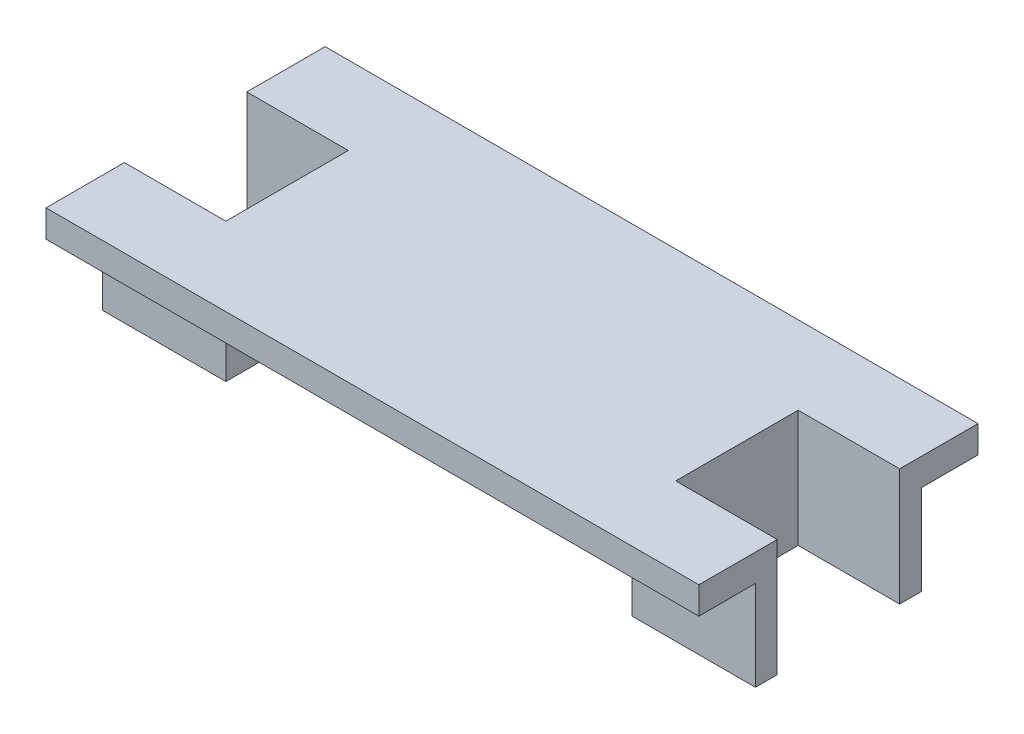
ISO-10303-21;
HEADER;
FILE_DESCRIPTION(('STEP AP214'),'2;1');
FILE_NAME('part.step','',(''),(''),'','','');
FILE_SCHEMA(('AUTOMOTIVE_DESIGN { 1 0 10303 214 1 1 1 1 }'));
ENDSEC;
DATA;
#1=APPLICATION_CONTEXT('core data for automotive mechanical design processes');
#2=APPLICATION_PROTOCOL_DEFINITION('international standard','automotive_design',2000,#1);
#3=PRODUCT_CONTEXT('',#1,'mechanical');
#4=PRODUCT('Part','Part','',(#3));
#5=PRODUCT_RELATED_PRODUCT_CATEGORY('part','',(#4));
#6=PRODUCT_DEFINITION_FORMATION('','',#4);
#7=PRODUCT_DEFINITION_CONTEXT('part definition',#1,'design');
#8=PRODUCT_DEFINITION('design','',#6,#7);
#9=PRODUCT_DEFINITION_SHAPE('','',#8);
#10=(LENGTH_UNIT() NAMED_UNIT(*) SI_UNIT(.MILLI.,.METRE.));
#11=(NAMED_UNIT(*) PLANE_ANGLE_UNIT() SI_UNIT($,.RADIAN.));
#12=(NAMED_UNIT(*) SI_UNIT($,.STERADIAN.) SOLID_ANGLE_UNIT());
#13=UNCERTAINTY_MEASURE_WITH_UNIT(LENGTH_MEASURE(1.E-05),#10,'distance_accuracy_value','');
#14=(GEOMETRIC_REPRESENTATION_CONTEXT(3) GLOBAL_UNCERTAINTY_ASSIGNED_CONTEXT((#13)) GLOBAL_UNIT_ASSIGNED_CONTEXT((#10,
#11,#12)) REPRESENTATION_CONTEXT('',''));
#15=CARTESIAN_POINT('',(0.,0.,0.));
#16=DIRECTION('',(0.,0.,1.));
#17=DIRECTION('',(1.,0.,0.));
#18=AXIS2_PLACEMENT_3D('',#15,#16,#17);
#19=CARTESIAN_POINT('',(0.,0.,0.));
#20=DIRECTION('',(0.,1.,0.));
#21=DIRECTION('',(0.,0.,1.));
#22=AXIS2_PLACEMENT_3D('',#19,#20,#21);
#23=PLANE('',#22);
#24=DIRECTION('',(1.,0.,0.));
#25=VECTOR('',#24,1.);
#26=CARTESIAN_POINT('',(-37.343,0.,-15.2535));
#27=LINE('',#26,#25);
#28=CARTESIAN_POINT('',(-60.,0.,-15.2535));
#29=VERTEX_POINT('',#28);
#30=CARTESIAN_POINT('',(-37.343,0.,-15.2535));
#31=VERTEX_POINT('',#30);
#32=EDGE_CURVE('E227',#29,#31,#27,.T.);
#33=ORIENTED_EDGE('',*,*,#32,.F.);
#34=DIRECTION('',(0.,0.,1.));
#35=VECTOR('',#34,1.);
#36=CARTESIAN_POINT('',(-60.,0.,-25.6535));
#37=LINE('',#36,#35);
#38=CARTESIAN_POINT('',(-60.,0.,-25.6535));
#39=VERTEX_POINT('',#38);
#40=EDGE_CURVE('E347',#39,#29,#37,.T.);
#41=ORIENTED_EDGE('',*,*,#40,.F.);
#42=DIRECTION('',(-1.,0.,0.));
#43=VECTOR('',#42,1.);
#44=CARTESIAN_POINT('',(-60.,0.,-25.6535));
#45=LINE('',#44,#43);
#46=CARTESIAN_POINT('',(60.,0.,-25.6535));
#47=VERTEX_POINT('',#46);
#48=EDGE_CURVE('E344',#47,#39,#45,.T.);
#49=ORIENTED_EDGE('',*,*,#48,.F.);
#50=DIRECTION('',(0.,0.,-1.));
#51=VECTOR('',#50,1.);
#52=CARTESIAN_POINT('',(60.,0.,-25.6535));
#53=LINE('',#52,#51);
#54=CARTESIAN_POINT('',(60.,0.,-15.2535));
#55=VERTEX_POINT('',#54);
#56=EDGE_CURVE('E341',#55,#47,#53,.T.);
#57=ORIENTED_EDGE('',*,*,#56,.F.);
#58=DIRECTION('',(1.,0.,0.));
#59=VECTOR('',#58,1.);
#60=CARTESIAN_POINT('',(37.343,0.,-15.2535));
#61=LINE('',#60,#59);
#62=CARTESIAN_POINT('',(37.343,0.,-15.2535));
#63=VERTEX_POINT('',#62);
#64=EDGE_CURVE('E63',#63,#55,#61,.T.);
#65=ORIENTED_EDGE('',*,*,#64,.F.);
#66=DIRECTION('',(0.,0.,-1.));
#67=VECTOR('',#66,1.);
#68=CARTESIAN_POINT('',(37.343,0.,15.2535));
#69=LINE('',#68,#67);
#70=CARTESIAN_POINT('',(37.343,0.,15.2535));
#71=VERTEX_POINT('',#70);
#72=EDGE_CURVE('E279',#71,#63,#69,.T.);
#73=ORIENTED_EDGE('',*,*,#72,.F.);
#74=DIRECTION('',(-1.,0.,0.));
#75=VECTOR('',#74,1.);
#76=CARTESIAN_POINT('',(60.,0.,15.2535));
#77=LINE('',#76,#75);
#78=CARTESIAN_POINT('',(60.,0.,15.2535));
#79=VERTEX_POINT('',#78);
#80=EDGE_CURVE('E245',#79,#71,#77,.T.);
#81=ORIENTED_EDGE('',*,*,#80,.F.);
#82=DIRECTION('',(0.,0.,-1.));
#83=VECTOR('',#82,1.);
#84=CARTESIAN_POINT('',(60.,0.,11.2535));
#85=LINE('',#84,#83);
#86=CARTESIAN_POINT('',(60.,0.,25.6535));
#87=VERTEX_POINT('',#86);
#88=EDGE_CURVE('E299',#87,#79,#85,.T.);
#89=ORIENTED_EDGE('',*,*,#88,.F.);
#90=DIRECTION('',(1.,0.,0.));
#91=VECTOR('',#90,1.);
#92=CARTESIAN_POINT('',(-60.,0.,25.6535));
#93=LINE('',#92,#91);
#94=CARTESIAN_POINT('',(-60.,0.,25.6535));
#95=VERTEX_POINT('',#94);
#96=EDGE_CURVE('E305',#95,#87,#93,.T.);
#97=ORIENTED_EDGE('',*,*,#96,.F.);
#98=DIRECTION('',(0.,0.,1.));
#99=VECTOR('',#98,1.);
#100=CARTESIAN_POINT('',(-60.,0.,11.24975));
#101=LINE('',#100,#99);
#102=CARTESIAN_POINT('',(-60.,0.,15.24975));
#103=VERTEX_POINT('',#102);
#104=EDGE_CURVE('E351',#103,#95,#101,.T.);
#105=ORIENTED_EDGE('',*,*,#104,.F.);
#106=DIRECTION('',(-1.,0.,0.));
#107=VECTOR('',#106,1.);
#108=CARTESIAN_POINT('',(-60.,0.,15.24975));
#109=LINE('',#108,#107);
#110=CARTESIAN_POINT('',(-37.343,0.,15.24975));
#111=VERTEX_POINT('',#110);
#112=EDGE_CURVE('E205',#111,#103,#109,.T.);
#113=ORIENTED_EDGE('',*,*,#112,.F.);
#114=DIRECTION('',(0.,0.,1.));
#115=VECTOR('',#114,1.);
#116=CARTESIAN_POINT('',(-37.343,0.,15.24975));
#117=LINE('',#116,#115);
#118=EDGE_CURVE('E208',#31,#111,#117,.T.);
#119=ORIENTED_EDGE('',*,*,#118,.F.);
#120=EDGE_LOOP('',(#33,#41,#49,#57,#65,#73,#81,#89,#97,#105,#113,#119));
#121=FACE_BOUND('',#120,.T.);
#122=ADVANCED_FACE('F39',(#121),#23,.F.);
#123=CARTESIAN_POINT('',(60.,5.,11.2535));
#124=DIRECTION('',(-1.,0.,0.));
#125=DIRECTION('',(0.,0.,1.));
#126=AXIS2_PLACEMENT_3D('',#123,#124,#125);
#127=PLANE('',#126);
#128=ORIENTED_EDGE('',*,*,#88,.T.);
#129=DIRECTION('',(0.,1.,0.));
#130=VECTOR('',#129,1.);
#131=CARTESIAN_POINT('',(60.,-16.532,15.2535));
#132=LINE('',#131,#130);
#133=CARTESIAN_POINT('',(60.,-16.532,15.2535));
#134=VERTEX_POINT('',#133);
#135=EDGE_CURVE('E295',#134,#79,#132,.T.);
#136=ORIENTED_EDGE('',*,*,#135,.F.);
#137=DIRECTION('',(0.,0.,1.));
#138=VECTOR('',#137,1.);
#139=CARTESIAN_POINT('',(60.,-16.532,11.2535));
#140=LINE('',#139,#138);
#141=CARTESIAN_POINT('',(60.,-16.532,11.2535));
#142=VERTEX_POINT('',#141);
#143=EDGE_CURVE('E246',#142,#134,#140,.T.);
#144=ORIENTED_EDGE('',*,*,#143,.F.);
#145=DIRECTION('',(0.,-1.,0.));
#146=VECTOR('',#145,1.);
#147=CARTESIAN_POINT('',(60.,5.,11.2535));
#148=LINE('',#147,#146);
#149=CARTESIAN_POINT('',(60.,5.,11.2535));
#150=VERTEX_POINT('',#149);
#151=EDGE_CURVE('E11',#150,#142,#148,.T.);
#152=ORIENTED_EDGE('',*,*,#151,.F.);
#153=DIRECTION('',(0.,0.,-1.));
#154=VECTOR('',#153,1.);
#155=CARTESIAN_POINT('',(60.,5.,11.2535));
#156=LINE('',#155,#154);
#157=CARTESIAN_POINT('',(60.,5.,25.6535));
#158=VERTEX_POINT('',#157);
#159=EDGE_CURVE('E300',#158,#150,#156,.T.);
#160=ORIENTED_EDGE('',*,*,#159,.F.);
#161=DIRECTION('',(0.,-1.,0.));
#162=VECTOR('',#161,1.);
#163=CARTESIAN_POINT('',(60.,5.,25.6535));
#164=LINE('',#163,#162);
#165=EDGE_CURVE('E337',#158,#87,#164,.T.);
#166=ORIENTED_EDGE('',*,*,#165,.T.);
#167=EDGE_LOOP('',(#128,#136,#144,#152,#160,#166));
#168=FACE_BOUND('',#167,.T.);
#169=ADVANCED_FACE('F41',(#168),#127,.F.);
#170=CARTESIAN_POINT('',(41.343,5.,11.2535));
#171=DIRECTION('',(0.,0.,1.));
#172=DIRECTION('',(1.,0.,0.));
#173=AXIS2_PLACEMENT_3D('',#170,#171,#172);
#174=PLANE('',#173);
#175=ORIENTED_EDGE('',*,*,#151,.T.);
#176=DIRECTION('',(1.,0.,0.));
#177=VECTOR('',#176,1.);
#178=CARTESIAN_POINT('',(41.343,-16.532,11.2535));
#179=LINE('',#178,#177);
#180=CARTESIAN_POINT('',(41.343,-16.532,11.2535));
#181=VERTEX_POINT('',#180);
#182=EDGE_CURVE('E271',#181,#142,#179,.T.);
#183=ORIENTED_EDGE('',*,*,#182,.F.);
#184=DIRECTION('',(0.,-1.,0.));
#185=VECTOR('',#184,1.);
#186=CARTESIAN_POINT('',(41.343,5.,11.2535));
#187=LINE('',#186,#185);
#188=CARTESIAN_POINT('',(41.343,5.,11.2535));
#189=VERTEX_POINT('',#188);
#190=EDGE_CURVE('E48',#189,#181,#187,.T.);
#191=ORIENTED_EDGE('',*,*,#190,.F.);
#192=DIRECTION('',(-1.,0.,0.));
#193=VECTOR('',#192,1.);
#194=CARTESIAN_POINT('',(41.343,5.,11.2535));
#195=LINE('',#194,#193);
#196=EDGE_CURVE('E304',#150,#189,#195,.T.);
#197=ORIENTED_EDGE('',*,*,#196,.F.);
#198=EDGE_LOOP('',(#175,#183,#191,#197));
#199=FACE_BOUND('',#198,.T.);
#200=ADVANCED_FACE('F396',(#199),#174,.F.);
#201=CARTESIAN_POINT('',(41.343,5.,-11.2535));
#202=DIRECTION('',(-1.,0.,0.));
#203=DIRECTION('',(0.,0.,1.));
#204=AXIS2_PLACEMENT_3D('',#201,#202,#203);
#205=PLANE('',#204);
#206=ORIENTED_EDGE('',*,*,#190,.T.);
#207=DIRECTION('',(0.,0.,1.));
#208=VECTOR('',#207,1.);
#209=CARTESIAN_POINT('',(41.343,-16.532,-11.2535));
#210=LINE('',#209,#208);
#211=CARTESIAN_POINT('',(41.343,-16.532,-11.2535));
#212=VERTEX_POINT('',#211);
#213=EDGE_CURVE('E267',#212,#181,#210,.T.);
#214=ORIENTED_EDGE('',*,*,#213,.F.);
#215=DIRECTION('',(0.,-1.,0.));
#216=VECTOR('',#215,1.);
#217=CARTESIAN_POINT('',(41.343,5.,-11.2535));
#218=LINE('',#217,#216);
#219=CARTESIAN_POINT('',(41.343,5.,-11.2535));
#220=VERTEX_POINT('',#219);
#221=EDGE_CURVE('E381',#220,#212,#218,.T.);
#222=ORIENTED_EDGE('',*,*,#221,.F.);
#223=DIRECTION('',(0.,0.,-1.));
#224=VECTOR('',#223,1.);
#225=CARTESIAN_POINT('',(41.343,5.,-11.2535));
#226=LINE('',#225,#224);
#227=EDGE_CURVE('E308',#189,#220,#226,.T.);
#228=ORIENTED_EDGE('',*,*,#227,.F.);
#229=EDGE_LOOP('',(#206,#214,#222,#228));
#230=FACE_BOUND('',#229,.T.);
#231=ADVANCED_FACE('F388',(#230),#205,.F.);
#232=CARTESIAN_POINT('',(60.,5.,-11.2535));
#233=DIRECTION('',(0.,0.,-1.));
#234=DIRECTION('',(-1.,0.,0.));
#235=AXIS2_PLACEMENT_3D('',#232,#233,#234);
#236=PLANE('',#235);
#237=ORIENTED_EDGE('',*,*,#221,.T.);
#238=DIRECTION('',(-1.,0.,0.));
#239=VECTOR('',#238,1.);
#240=CARTESIAN_POINT('',(60.,-16.532,-11.2535));
#241=LINE('',#240,#239);
#242=CARTESIAN_POINT('',(60.,-16.532,-11.2535));
#243=VERTEX_POINT('',#242);
#244=EDGE_CURVE('E263',#243,#212,#241,.T.);
#245=ORIENTED_EDGE('',*,*,#244,.F.);
#246=DIRECTION('',(0.,-1.,0.));
#247=VECTOR('',#246,1.);
#248=CARTESIAN_POINT('',(60.,5.,-11.2535));
#249=LINE('',#248,#247);
#250=CARTESIAN_POINT('',(60.,5.,-11.2535));
#251=VERTEX_POINT('',#250);
#252=EDGE_CURVE('E378',#251,#243,#249,.T.);
#253=ORIENTED_EDGE('',*,*,#252,.F.);
#254=DIRECTION('',(1.,0.,0.));
#255=VECTOR('',#254,1.);
#256=CARTESIAN_POINT('',(60.,5.,-11.2535));
#257=LINE('',#256,#255);
#258=EDGE_CURVE('E311',#220,#251,#257,.T.);
#259=ORIENTED_EDGE('',*,*,#258,.F.);
#260=EDGE_LOOP('',(#237,#245,#253,#259));
#261=FACE_BOUND('',#260,.T.);
#262=ADVANCED_FACE('F416',(#261),#236,.F.);
#263=CARTESIAN_POINT('',(60.,5.,-25.6535));
#264=DIRECTION('',(-1.,0.,0.));
#265=DIRECTION('',(0.,0.,1.));
#266=AXIS2_PLACEMENT_3D('',#263,#264,#265);
#267=PLANE('',#266);
#268=ORIENTED_EDGE('',*,*,#252,.T.);
#269=DIRECTION('',(0.,0.,1.));
#270=VECTOR('',#269,1.);
#271=CARTESIAN_POINT('',(60.,-16.532,-15.2535));
#272=LINE('',#271,#270);
#273=CARTESIAN_POINT('',(60.,-16.532,-15.2535));
#274=VERTEX_POINT('',#273);
#275=EDGE_CURVE('E259',#274,#243,#272,.T.);
#276=ORIENTED_EDGE('',*,*,#275,.F.);
#277=DIRECTION('',(0.,1.,0.));
#278=VECTOR('',#277,1.);
#279=CARTESIAN_POINT('',(60.,-16.532,-15.2535));
#280=LINE('',#279,#278);
#281=EDGE_CURVE('E275',#274,#55,#280,.T.);
#282=ORIENTED_EDGE('',*,*,#281,.T.);
#283=ORIENTED_EDGE('',*,*,#56,.T.);
#284=DIRECTION('',(0.,-1.,0.));
#285=VECTOR('',#284,1.);
#286=CARTESIAN_POINT('',(60.,5.,-25.6535));
#287=LINE('',#286,#285);
#288=CARTESIAN_POINT('',(60.,5.,-25.6535));
#289=VERTEX_POINT('',#288);
#290=EDGE_CURVE('E374',#289,#47,#287,.T.);
#291=ORIENTED_EDGE('',*,*,#290,.F.);
#292=DIRECTION('',(0.,0.,-1.));
#293=VECTOR('',#292,1.);
#294=CARTESIAN_POINT('',(60.,5.,-25.6535));
#295=LINE('',#294,#293);
#296=EDGE_CURVE('E314',#251,#289,#295,.T.);
#297=ORIENTED_EDGE('',*,*,#296,.F.);
#298=EDGE_LOOP('',(#268,#276,#282,#283,#291,#297));
#299=FACE_BOUND('',#298,.T.);
#300=ADVANCED_FACE('F521',(#299),#267,.F.);
#301=CARTESIAN_POINT('',(-60.,5.,-25.6535));
#302=DIRECTION('',(0.,0.,1.));
#303=DIRECTION('',(1.,0.,0.));
#304=AXIS2_PLACEMENT_3D('',#301,#302,#303);
#305=PLANE('',#304);
#306=ORIENTED_EDGE('',*,*,#48,.T.);
#307=DIRECTION('',(0.,-1.,0.));
#308=VECTOR('',#307,1.);
#309=CARTESIAN_POINT('',(-60.,5.,-25.6535));
#310=LINE('',#309,#308);
#311=CARTESIAN_POINT('',(-60.,5.,-25.6535));
#312=VERTEX_POINT('',#311);
#313=EDGE_CURVE('E370',#312,#39,#310,.T.);
#314=ORIENTED_EDGE('',*,*,#313,.F.);
#315=DIRECTION('',(-1.,0.,0.));
#316=VECTOR('',#315,1.);
#317=CARTESIAN_POINT('',(-60.,5.,-25.6535));
#318=LINE('',#317,#316);
#319=EDGE_CURVE('E317',#289,#312,#318,.T.);
#320=ORIENTED_EDGE('',*,*,#319,.F.);
#321=ORIENTED_EDGE('',*,*,#290,.T.);
#322=EDGE_LOOP('',(#306,#314,#320,#321));
#323=FACE_BOUND('',#322,.T.);
#324=ADVANCED_FACE('F516',(#323),#305,.F.);
#325=CARTESIAN_POINT('',(-60.,5.,-25.6535));
#326=DIRECTION('',(1.,0.,0.));
#327=DIRECTION('',(0.,0.,-1.));
#328=AXIS2_PLACEMENT_3D('',#325,#326,#327);
#329=PLANE('',#328);
#330=ORIENTED_EDGE('',*,*,#40,.T.);
#331=DIRECTION('',(0.,1.,0.));
#332=VECTOR('',#331,1.);
#333=CARTESIAN_POINT('',(-60.,-16.532,-15.2535));
#334=LINE('',#333,#332);
#335=CARTESIAN_POINT('',(-60.,-16.532,-15.2535));
#336=VERTEX_POINT('',#335);
#337=EDGE_CURVE('E242',#336,#29,#334,.T.);
#338=ORIENTED_EDGE('',*,*,#337,.F.);
#339=DIRECTION('',(0.,0.,-1.));
#340=VECTOR('',#339,1.);
#341=CARTESIAN_POINT('',(-60.,-16.532,-15.2535));
#342=LINE('',#341,#340);
#343=CARTESIAN_POINT('',(-60.,-16.532,-11.24975));
#344=VERTEX_POINT('',#343);
#345=EDGE_CURVE('E213',#344,#336,#342,.T.);
#346=ORIENTED_EDGE('',*,*,#345,.F.);
#347=DIRECTION('',(0.,-1.,0.));
#348=VECTOR('',#347,1.);
#349=CARTESIAN_POINT('',(-60.,5.,-11.24975));
#350=LINE('',#349,#348);
#351=CARTESIAN_POINT('',(-60.,5.,-11.24975));
#352=VERTEX_POINT('',#351);
#353=EDGE_CURVE('E367',#352,#344,#350,.T.);
#354=ORIENTED_EDGE('',*,*,#353,.F.);
#355=DIRECTION('',(0.,0.,1.));
#356=VECTOR('',#355,1.);
#357=CARTESIAN_POINT('',(-60.,5.,-25.6535));
#358=LINE('',#357,#356);
#359=EDGE_CURVE('E320',#312,#352,#358,.T.);
#360=ORIENTED_EDGE('',*,*,#359,.F.);
#361=ORIENTED_EDGE('',*,*,#313,.T.);
#362=EDGE_LOOP('',(#330,#338,#346,#354,#360,#361));
#363=FACE_BOUND('',#362,.T.);
#364=ADVANCED_FACE('F520',(#363),#329,.F.);
#365=CARTESIAN_POINT('',(-60.,5.,-11.24975));
#366=DIRECTION('',(0.,0.,-1.));
#367=DIRECTION('',(-1.,0.,0.));
#368=AXIS2_PLACEMENT_3D('',#365,#366,#367);
#369=PLANE('',#368);
#370=ORIENTED_EDGE('',*,*,#353,.T.);
#371=DIRECTION('',(-1.,0.,0.));
#372=VECTOR('',#371,1.);
#373=CARTESIAN_POINT('',(-60.,-16.532,-11.24975));
#374=LINE('',#373,#372);
#375=CARTESIAN_POINT('',(-41.343,-16.532,-11.24975));
#376=VERTEX_POINT('',#375);
#377=EDGE_CURVE('E199',#376,#344,#374,.T.);
#378=ORIENTED_EDGE('',*,*,#377,.F.);
#379=DIRECTION('',(0.,-1.,0.));
#380=VECTOR('',#379,1.);
#381=CARTESIAN_POINT('',(-41.343,5.,-11.24975));
#382=LINE('',#381,#380);
#383=CARTESIAN_POINT('',(-41.343,5.,-11.24975));
#384=VERTEX_POINT('',#383);
#385=EDGE_CURVE('E188',#384,#376,#382,.T.);
#386=ORIENTED_EDGE('',*,*,#385,.F.);
#387=DIRECTION('',(1.,0.,0.));
#388=VECTOR('',#387,1.);
#389=CARTESIAN_POINT('',(-60.,5.,-11.24975));
#390=LINE('',#389,#388);
#391=EDGE_CURVE('E323',#352,#384,#390,.T.);
#392=ORIENTED_EDGE('',*,*,#391,.F.);
#393=EDGE_LOOP('',(#370,#378,#386,#392));
#394=FACE_BOUND('',#393,.T.);
#395=ADVANCED_FACE('F537',(#394),#369,.F.);
#396=CARTESIAN_POINT('',(-41.343,5.,-11.24975));
#397=DIRECTION('',(1.,0.,0.));
#398=DIRECTION('',(0.,0.,-1.));
#399=AXIS2_PLACEMENT_3D('',#396,#397,#398);
#400=PLANE('',#399);
#401=ORIENTED_EDGE('',*,*,#385,.T.);
#402=DIRECTION('',(0.,0.,-1.));
#403=VECTOR('',#402,1.);
#404=CARTESIAN_POINT('',(-41.343,-16.532,-11.24975));
#405=LINE('',#404,#403);
#406=CARTESIAN_POINT('',(-41.343,-16.532,11.24975));
#407=VERTEX_POINT('',#406);
#408=EDGE_CURVE('E192',#407,#376,#405,.T.);
#409=ORIENTED_EDGE('',*,*,#408,.F.);
#410=DIRECTION('',(0.,-1.,0.));
#411=VECTOR('',#410,1.);
#412=CARTESIAN_POINT('',(-41.343,5.,11.24975));
#413=LINE('',#412,#411);
#414=CARTESIAN_POINT('',(-41.343,5.,11.24975));
#415=VERTEX_POINT('',#414);
#416=EDGE_CURVE('E178',#415,#407,#413,.T.);
#417=ORIENTED_EDGE('',*,*,#416,.F.);
#418=DIRECTION('',(0.,0.,1.));
#419=VECTOR('',#418,1.);
#420=CARTESIAN_POINT('',(-41.343,5.,-11.24975));
#421=LINE('',#420,#419);
#422=EDGE_CURVE('E326',#384,#415,#421,.T.);
#423=ORIENTED_EDGE('',*,*,#422,.F.);
#424=EDGE_LOOP('',(#401,#409,#417,#423));
#425=FACE_BOUND('',#424,.T.);
#426=ADVANCED_FACE('F193',(#425),#400,.F.);
#427=CARTESIAN_POINT('',(-41.343,5.,11.24975));
#428=DIRECTION('',(0.,0.,1.));
#429=DIRECTION('',(1.,0.,0.));
#430=AXIS2_PLACEMENT_3D('',#427,#428,#429);
#431=PLANE('',#430);
#432=ORIENTED_EDGE('',*,*,#416,.T.);
#433=DIRECTION('',(1.,0.,0.));
#434=VECTOR('',#433,1.);
#435=CARTESIAN_POINT('',(-41.343,-16.532,11.24975));
#436=LINE('',#435,#434);
#437=CARTESIAN_POINT('',(-60.,-16.532,11.24975));
#438=VERTEX_POINT('',#437);
#439=EDGE_CURVE('E183',#438,#407,#436,.T.);
#440=ORIENTED_EDGE('',*,*,#439,.F.);
#441=DIRECTION('',(0.,-1.,0.));
#442=VECTOR('',#441,1.);
#443=CARTESIAN_POINT('',(-60.,5.,11.24975));
#444=LINE('',#443,#442);
#445=CARTESIAN_POINT('',(-60.,5.,11.24975));
#446=VERTEX_POINT('',#445);
#447=EDGE_CURVE('E189',#446,#438,#444,.T.);
#448=ORIENTED_EDGE('',*,*,#447,.F.);
#449=DIRECTION('',(-1.,0.,0.));
#450=VECTOR('',#449,1.);
#451=CARTESIAN_POINT('',(-41.343,5.,11.24975));
#452=LINE('',#451,#450);
#453=EDGE_CURVE('E184',#415,#446,#452,.T.);
#454=ORIENTED_EDGE('',*,*,#453,.F.);
#455=EDGE_LOOP('',(#432,#440,#448,#454));
#456=FACE_BOUND('',#455,.T.);
#457=ADVANCED_FACE('F180',(#456),#431,.F.);
#458=CARTESIAN_POINT('',(-60.,5.,11.24975));
#459=DIRECTION('',(1.,0.,0.));
#460=DIRECTION('',(0.,0.,-1.));
#461=AXIS2_PLACEMENT_3D('',#458,#459,#460);
#462=PLANE('',#461);
#463=ORIENTED_EDGE('',*,*,#447,.T.);
#464=DIRECTION('',(0.,0.,-1.));
#465=VECTOR('',#464,1.);
#466=CARTESIAN_POINT('',(-60.,-16.532,11.24975));
#467=LINE('',#466,#465);
#468=CARTESIAN_POINT('',(-60.,-16.532,15.24975));
#469=VERTEX_POINT('',#468);
#470=EDGE_CURVE('E203',#469,#438,#467,.T.);
#471=ORIENTED_EDGE('',*,*,#470,.F.);
#472=DIRECTION('',(0.,1.,0.));
#473=VECTOR('',#472,1.);
#474=CARTESIAN_POINT('',(-60.,-16.532,15.24975));
#475=LINE('',#474,#473);
#476=EDGE_CURVE('E55',#469,#103,#475,.T.);
#477=ORIENTED_EDGE('',*,*,#476,.T.);
#478=ORIENTED_EDGE('',*,*,#104,.T.);
#479=DIRECTION('',(0.,-1.,0.));
#480=VECTOR('',#479,1.);
#481=CARTESIAN_POINT('',(-60.,5.,25.6535));
#482=LINE('',#481,#480);
#483=CARTESIAN_POINT('',(-60.,5.,25.6535));
#484=VERTEX_POINT('',#483);
#485=EDGE_CURVE('E359',#484,#95,#482,.T.);
#486=ORIENTED_EDGE('',*,*,#485,.F.);
#487=DIRECTION('',(0.,0.,1.));
#488=VECTOR('',#487,1.);
#489=CARTESIAN_POINT('',(-60.,5.,11.24975));
#490=LINE('',#489,#488);
#491=EDGE_CURVE('E331',#446,#484,#490,.T.);
#492=ORIENTED_EDGE('',*,*,#491,.F.);
#493=EDGE_LOOP('',(#463,#471,#477,#478,#486,#492));
#494=FACE_BOUND('',#493,.T.);
#495=ADVANCED_FACE('F434',(#494),#462,.F.);
#496=CARTESIAN_POINT('',(-60.,5.,25.6535));
#497=DIRECTION('',(0.,0.,-1.));
#498=DIRECTION('',(-1.,0.,0.));
#499=AXIS2_PLACEMENT_3D('',#496,#497,#498);
#500=PLANE('',#499);
#501=ORIENTED_EDGE('',*,*,#96,.T.);
#502=ORIENTED_EDGE('',*,*,#165,.F.);
#503=DIRECTION('',(1.,0.,0.));
#504=VECTOR('',#503,1.);
#505=CARTESIAN_POINT('',(-60.,5.,25.6535));
#506=LINE('',#505,#504);
#507=EDGE_CURVE('E334',#484,#158,#506,.T.);
#508=ORIENTED_EDGE('',*,*,#507,.F.);
#509=ORIENTED_EDGE('',*,*,#485,.T.);
#510=EDGE_LOOP('',(#501,#502,#508,#509));
#511=FACE_BOUND('',#510,.T.);
#512=ADVANCED_FACE('F427',(#511),#500,.F.);
#513=CARTESIAN_POINT('',(0.,5.,0.));
#514=DIRECTION('',(0.,1.,0.));
#515=DIRECTION('',(0.,0.,1.));
#516=AXIS2_PLACEMENT_3D('',#513,#514,#515);
#517=PLANE('',#516);
#518=ORIENTED_EDGE('',*,*,#159,.T.);
#519=ORIENTED_EDGE('',*,*,#196,.T.);
#520=ORIENTED_EDGE('',*,*,#227,.T.);
#521=ORIENTED_EDGE('',*,*,#258,.T.);
#522=ORIENTED_EDGE('',*,*,#296,.T.);
#523=ORIENTED_EDGE('',*,*,#319,.T.);
#524=ORIENTED_EDGE('',*,*,#359,.T.);
#525=ORIENTED_EDGE('',*,*,#391,.T.);
#526=ORIENTED_EDGE('',*,*,#422,.T.);
#527=ORIENTED_EDGE('',*,*,#453,.T.);
#528=ORIENTED_EDGE('',*,*,#491,.T.);
#529=ORIENTED_EDGE('',*,*,#507,.T.);
#530=EDGE_LOOP('',(#518,#519,#520,#521,#522,#523,#524,#525,#526,#527,#528,#529));
#531=FACE_BOUND('',#530,.T.);
#532=ADVANCED_FACE('F420',(#531),#517,.T.);
#533=CARTESIAN_POINT('',(60.,-16.532,15.2535));
#534=DIRECTION('',(0.,0.,-1.));
#535=DIRECTION('',(-1.,0.,0.));
#536=AXIS2_PLACEMENT_3D('',#533,#534,#535);
#537=PLANE('',#536);
#538=ORIENTED_EDGE('',*,*,#80,.T.);
#539=DIRECTION('',(0.,1.,0.));
#540=VECTOR('',#539,1.);
#541=CARTESIAN_POINT('',(37.343,-16.532,15.2535));
#542=LINE('',#541,#540);
#543=CARTESIAN_POINT('',(37.343,-16.532,15.2535));
#544=VERTEX_POINT('',#543);
#545=EDGE_CURVE('E291',#544,#71,#542,.T.);
#546=ORIENTED_EDGE('',*,*,#545,.F.);
#547=DIRECTION('',(-1.,0.,0.));
#548=VECTOR('',#547,1.);
#549=CARTESIAN_POINT('',(60.,-16.532,15.2535));
#550=LINE('',#549,#548);
#551=EDGE_CURVE('E250',#134,#544,#550,.T.);
#552=ORIENTED_EDGE('',*,*,#551,.F.);
#553=ORIENTED_EDGE('',*,*,#135,.T.);
#554=EDGE_LOOP('',(#538,#546,#552,#553));
#555=FACE_BOUND('',#554,.T.);
#556=ADVANCED_FACE('F405',(#555),#537,.F.);
#557=CARTESIAN_POINT('',(37.343,-16.532,15.2535));
#558=DIRECTION('',(1.,0.,0.));
#559=DIRECTION('',(0.,0.,-1.));
#560=AXIS2_PLACEMENT_3D('',#557,#558,#559);
#561=PLANE('',#560);
#562=ORIENTED_EDGE('',*,*,#72,.T.);
#563=DIRECTION('',(0.,1.,0.));
#564=VECTOR('',#563,1.);
#565=CARTESIAN_POINT('',(37.343,-16.532,-15.2535));
#566=LINE('',#565,#564);
#567=CARTESIAN_POINT('',(37.343,-16.532,-15.2535));
#568=VERTEX_POINT('',#567);
#569=EDGE_CURVE('E287',#568,#63,#566,.T.);
#570=ORIENTED_EDGE('',*,*,#569,.F.);
#571=DIRECTION('',(0.,0.,-1.));
#572=VECTOR('',#571,1.);
#573=CARTESIAN_POINT('',(37.343,-16.532,15.2535));
#574=LINE('',#573,#572);
#575=EDGE_CURVE('E253',#544,#568,#574,.T.);
#576=ORIENTED_EDGE('',*,*,#575,.F.);
#577=ORIENTED_EDGE('',*,*,#545,.T.);
#578=EDGE_LOOP('',(#562,#570,#576,#577));
#579=FACE_BOUND('',#578,.T.);
#580=ADVANCED_FACE('F407',(#579),#561,.F.);
#581=CARTESIAN_POINT('',(37.343,-16.532,-15.2535));
#582=DIRECTION('',(0.,0.,1.));
#583=DIRECTION('',(1.,0.,0.));
#584=AXIS2_PLACEMENT_3D('',#581,#582,#583);
#585=PLANE('',#584);
#586=ORIENTED_EDGE('',*,*,#64,.T.);
#587=ORIENTED_EDGE('',*,*,#281,.F.);
#588=DIRECTION('',(1.,0.,0.));
#589=VECTOR('',#588,1.);
#590=CARTESIAN_POINT('',(37.343,-16.532,-15.2535));
#591=LINE('',#590,#589);
#592=EDGE_CURVE('E256',#568,#274,#591,.T.);
#593=ORIENTED_EDGE('',*,*,#592,.F.);
#594=ORIENTED_EDGE('',*,*,#569,.T.);
#595=EDGE_LOOP('',(#586,#587,#593,#594));
#596=FACE_BOUND('',#595,.T.);
#597=ADVANCED_FACE('F411',(#596),#585,.F.);
#598=CARTESIAN_POINT('',(0.,-16.532,0.));
#599=DIRECTION('',(0.,-1.,0.));
#600=DIRECTION('',(0.,0.,-1.));
#601=AXIS2_PLACEMENT_3D('',#598,#599,#600);
#602=PLANE('',#601);
#603=ORIENTED_EDGE('',*,*,#143,.T.);
#604=ORIENTED_EDGE('',*,*,#551,.T.);
#605=ORIENTED_EDGE('',*,*,#575,.T.);
#606=ORIENTED_EDGE('',*,*,#592,.T.);
#607=ORIENTED_EDGE('',*,*,#275,.T.);
#608=ORIENTED_EDGE('',*,*,#244,.T.);
#609=ORIENTED_EDGE('',*,*,#213,.T.);
#610=ORIENTED_EDGE('',*,*,#182,.T.);
#611=EDGE_LOOP('',(#603,#604,#605,#606,#607,#608,#609,#610));
#612=FACE_BOUND('',#611,.T.);
#613=ADVANCED_FACE('F393',(#612),#602,.T.);
#614=CARTESIAN_POINT('',(-37.343,-16.532,-15.2535));
#615=DIRECTION('',(0.,0.,1.));
#616=DIRECTION('',(1.,0.,0.));
#617=AXIS2_PLACEMENT_3D('',#614,#615,#616);
#618=PLANE('',#617);
#619=ORIENTED_EDGE('',*,*,#32,.T.);
#620=DIRECTION('',(0.,1.,0.));
#621=VECTOR('',#620,1.);
#622=CARTESIAN_POINT('',(-37.343,-16.532,-15.2535));
#623=LINE('',#622,#621);
#624=CARTESIAN_POINT('',(-37.343,-16.532,-15.2535));
#625=VERTEX_POINT('',#624);
#626=EDGE_CURVE('E238',#625,#31,#623,.T.);
#627=ORIENTED_EDGE('',*,*,#626,.F.);
#628=DIRECTION('',(1.,0.,0.));
#629=VECTOR('',#628,1.);
#630=CARTESIAN_POINT('',(-37.343,-16.532,-15.2535));
#631=LINE('',#630,#629);
#632=EDGE_CURVE('E216',#336,#625,#631,.T.);
#633=ORIENTED_EDGE('',*,*,#632,.F.);
#634=ORIENTED_EDGE('',*,*,#337,.T.);
#635=EDGE_LOOP('',(#619,#627,#633,#634));
#636=FACE_BOUND('',#635,.T.);
#637=ADVANCED_FACE('F459',(#636),#618,.F.);
#638=CARTESIAN_POINT('',(-37.343,-16.532,15.24975));
#639=DIRECTION('',(-1.,0.,0.));
#640=DIRECTION('',(0.,0.,1.));
#641=AXIS2_PLACEMENT_3D('',#638,#639,#640);
#642=PLANE('',#641);
#643=ORIENTED_EDGE('',*,*,#118,.T.);
#644=DIRECTION('',(0.,1.,0.));
#645=VECTOR('',#644,1.);
#646=CARTESIAN_POINT('',(-37.343,-16.532,15.24975));
#647=LINE('',#646,#645);
#648=CARTESIAN_POINT('',(-37.343,-16.532,15.24975));
#649=VERTEX_POINT('',#648);
#650=EDGE_CURVE('E234',#649,#111,#647,.T.);
#651=ORIENTED_EDGE('',*,*,#650,.F.);
#652=DIRECTION('',(0.,0.,1.));
#653=VECTOR('',#652,1.);
#654=CARTESIAN_POINT('',(-37.343,-16.532,15.24975));
#655=LINE('',#654,#653);
#656=EDGE_CURVE('E219',#625,#649,#655,.T.);
#657=ORIENTED_EDGE('',*,*,#656,.F.);
#658=ORIENTED_EDGE('',*,*,#626,.T.);
#659=EDGE_LOOP('',(#643,#651,#657,#658));
#660=FACE_BOUND('',#659,.T.);
#661=ADVANCED_FACE('F462',(#660),#642,.F.);
#662=CARTESIAN_POINT('',(-60.,-16.532,15.24975));
#663=DIRECTION('',(0.,0.,-1.));
#664=DIRECTION('',(-1.,0.,0.));
#665=AXIS2_PLACEMENT_3D('',#662,#663,#664);
#666=PLANE('',#665);
#667=ORIENTED_EDGE('',*,*,#112,.T.);
#668=ORIENTED_EDGE('',*,*,#476,.F.);
#669=DIRECTION('',(-1.,0.,0.));
#670=VECTOR('',#669,1.);
#671=CARTESIAN_POINT('',(-60.,-16.532,15.24975));
#672=LINE('',#671,#670);
#673=EDGE_CURVE('E222',#649,#469,#672,.T.);
#674=ORIENTED_EDGE('',*,*,#673,.F.);
#675=ORIENTED_EDGE('',*,*,#650,.T.);
#676=EDGE_LOOP('',(#667,#668,#674,#675));
#677=FACE_BOUND('',#676,.T.);
#678=ADVANCED_FACE('F466',(#677),#666,.F.);
#679=CARTESIAN_POINT('',(0.,-16.532,0.));
#680=DIRECTION('',(0.,1.,0.));
#681=DIRECTION('',(0.,0.,1.));
#682=AXIS2_PLACEMENT_3D('',#679,#680,#681);
#683=PLANE('',#682);
#684=ORIENTED_EDGE('',*,*,#439,.T.);
#685=ORIENTED_EDGE('',*,*,#408,.T.);
#686=ORIENTED_EDGE('',*,*,#377,.T.);
#687=ORIENTED_EDGE('',*,*,#345,.T.);
#688=ORIENTED_EDGE('',*,*,#632,.T.);
#689=ORIENTED_EDGE('',*,*,#656,.T.);
#690=ORIENTED_EDGE('',*,*,#673,.T.);
#691=ORIENTED_EDGE('',*,*,#470,.T.);
#692=EDGE_LOOP('',(#684,#685,#686,#687,#688,#689,#690,#691));
#693=FACE_BOUND('',#692,.T.);
#694=ADVANCED_FACE('F202',(#693),#683,.F.);
#695=CLOSED_SHELL('',(#122,#169,#200,#231,#262,#300,#324,#364,#395,#426,#457,#495,#512,#532,
#556,#580,#597,#613,#637,#661,#678,#694));
#696=MANIFOLD_SOLID_BREP('B2',#695);
#697=ADVANCED_BREP_SHAPE_REPRESENTATION('',(#18,#696),#14);
#698=SHAPE_DEFINITION_REPRESENTATION(#9,#697);
ENDSEC;
END-ISO-10303-21;
